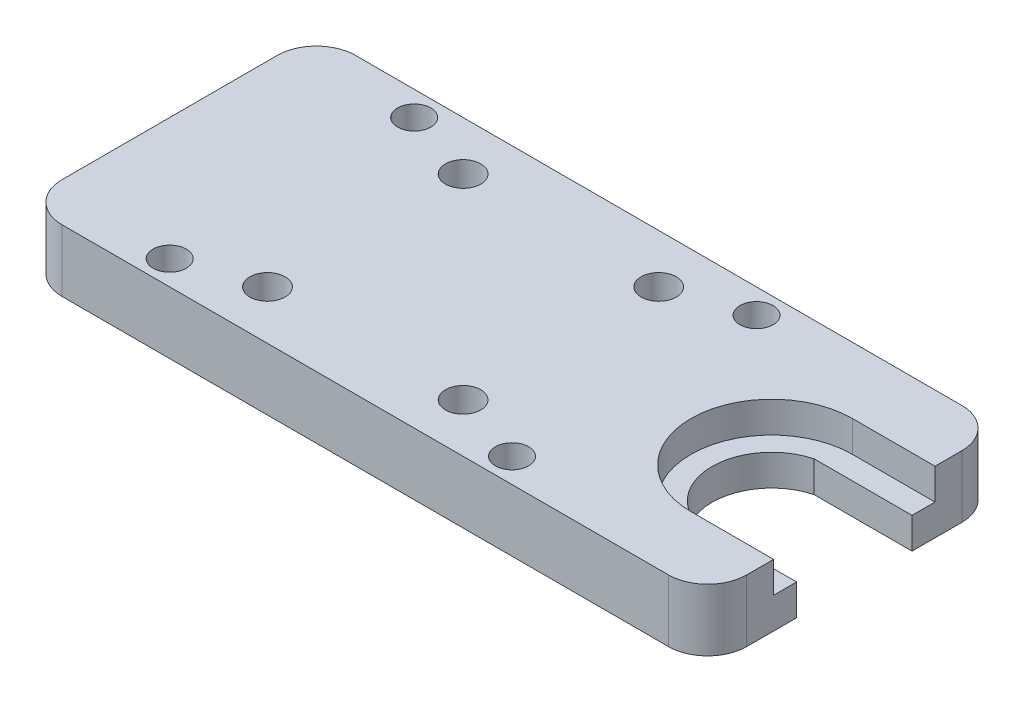
ISO-10303-21;
HEADER;
FILE_DESCRIPTION(('STEP AP214'),'2;1');
FILE_NAME('part.step','',(''),(''),'','','');
FILE_SCHEMA(('AUTOMOTIVE_DESIGN { 1 0 10303 214 1 1 1 1 }'));
ENDSEC;
DATA;
#1=APPLICATION_CONTEXT('core data for automotive mechanical design processes');
#2=APPLICATION_PROTOCOL_DEFINITION('international standard','automotive_design',2000,#1);
#3=PRODUCT_CONTEXT('',#1,'mechanical');
#4=PRODUCT('Part','Part','',(#3));
#5=PRODUCT_RELATED_PRODUCT_CATEGORY('part','',(#4));
#6=PRODUCT_DEFINITION_FORMATION('','',#4);
#7=PRODUCT_DEFINITION_CONTEXT('part definition',#1,'design');
#8=PRODUCT_DEFINITION('design','',#6,#7);
#9=PRODUCT_DEFINITION_SHAPE('','',#8);
#10=(LENGTH_UNIT() NAMED_UNIT(*) SI_UNIT(.MILLI.,.METRE.));
#11=(NAMED_UNIT(*) PLANE_ANGLE_UNIT() SI_UNIT($,.RADIAN.));
#12=(NAMED_UNIT(*) SI_UNIT($,.STERADIAN.) SOLID_ANGLE_UNIT());
#13=UNCERTAINTY_MEASURE_WITH_UNIT(LENGTH_MEASURE(1.E-05),#10,'distance_accuracy_value','');
#14=(GEOMETRIC_REPRESENTATION_CONTEXT(3) GLOBAL_UNCERTAINTY_ASSIGNED_CONTEXT((#13)) GLOBAL_UNIT_ASSIGNED_CONTEXT((#10,
#11,#12)) REPRESENTATION_CONTEXT('',''));
#15=CARTESIAN_POINT('',(0.,0.,0.));
#16=DIRECTION('',(0.,0.,1.));
#17=DIRECTION('',(1.,0.,0.));
#18=AXIS2_PLACEMENT_3D('',#15,#16,#17);
#19=CARTESIAN_POINT('',(28.5,6.35,3.));
#20=DIRECTION('',(1.,0.,0.));
#21=DIRECTION('',(0.,0.,-1.));
#22=AXIS2_PLACEMENT_3D('',#19,#20,#21);
#23=PLANE('',#22);
#24=DIRECTION('',(0.,0.,1.));
#25=VECTOR('',#24,1.);
#26=CARTESIAN_POINT('',(28.5,6.35,3.));
#27=LINE('',#26,#25);
#28=CARTESIAN_POINT('',(28.5,6.35,26.25));
#29=VERTEX_POINT('',#28);
#30=CARTESIAN_POINT('',(28.5,6.35,29.));
#31=VERTEX_POINT('',#30);
#32=EDGE_CURVE('E220',#29,#31,#27,.T.);
#33=ORIENTED_EDGE('',*,*,#32,.T.);
#34=DIRECTION('',(0.,-1.,0.));
#35=VECTOR('',#34,1.);
#36=CARTESIAN_POINT('',(28.5,6.35,29.));
#37=LINE('',#36,#35);
#38=CARTESIAN_POINT('',(28.5,0.,29.));
#39=VERTEX_POINT('',#38);
#40=EDGE_CURVE('E43',#31,#39,#37,.T.);
#41=ORIENTED_EDGE('',*,*,#40,.T.);
#42=DIRECTION('',(0.,0.,1.));
#43=VECTOR('',#42,1.);
#44=CARTESIAN_POINT('',(28.5,0.,3.));
#45=LINE('',#44,#43);
#46=CARTESIAN_POINT('',(28.5,0.,23.9));
#47=VERTEX_POINT('',#46);
#48=EDGE_CURVE('E229',#47,#39,#45,.T.);
#49=ORIENTED_EDGE('',*,*,#48,.F.);
#50=DIRECTION('',(0.,1.,0.));
#51=VECTOR('',#50,1.);
#52=CARTESIAN_POINT('',(28.5,0.,23.9));
#53=LINE('',#52,#51);
#54=CARTESIAN_POINT('',(28.5,3.175,23.9));
#55=VERTEX_POINT('',#54);
#56=EDGE_CURVE('E202',#47,#55,#53,.T.);
#57=ORIENTED_EDGE('',*,*,#56,.T.);
#58=DIRECTION('',(0.,0.,-1.));
#59=VECTOR('',#58,1.);
#60=CARTESIAN_POINT('',(28.5,3.175,9.75000000000001));
#61=LINE('',#60,#59);
#62=CARTESIAN_POINT('',(28.5,3.175,26.25));
#63=VERTEX_POINT('',#62);
#64=EDGE_CURVE('E160',#63,#55,#61,.T.);
#65=ORIENTED_EDGE('',*,*,#64,.F.);
#66=DIRECTION('',(0.,1.,0.));
#67=VECTOR('',#66,1.);
#68=CARTESIAN_POINT('',(28.5,3.175,26.25));
#69=LINE('',#68,#67);
#70=EDGE_CURVE('E189',#63,#29,#69,.T.);
#71=ORIENTED_EDGE('',*,*,#70,.T.);
#72=EDGE_LOOP('',(#33,#41,#49,#57,#65,#71));
#73=FACE_BOUND('',#72,.T.);
#74=ADVANCED_FACE('F35',(#73),#23,.T.);
#75=CARTESIAN_POINT('',(-41.5,6.35,33.));
#76=DIRECTION('',(-1.,0.,0.));
#77=DIRECTION('',(0.,0.,1.));
#78=AXIS2_PLACEMENT_3D('',#75,#76,#77);
#79=PLANE('',#78);
#80=DIRECTION('',(0.,0.,-1.));
#81=VECTOR('',#80,1.);
#82=CARTESIAN_POINT('',(-41.5,6.35,33.));
#83=LINE('',#82,#81);
#84=CARTESIAN_POINT('',(-41.5,6.35,29.));
#85=VERTEX_POINT('',#84);
#86=CARTESIAN_POINT('',(-41.5,6.35,7.));
#87=VERTEX_POINT('',#86);
#88=EDGE_CURVE('E213',#85,#87,#83,.T.);
#89=ORIENTED_EDGE('',*,*,#88,.T.);
#90=DIRECTION('',(0.,-1.,0.));
#91=VECTOR('',#90,1.);
#92=CARTESIAN_POINT('',(-41.5,6.35,7.));
#93=LINE('',#92,#91);
#94=CARTESIAN_POINT('',(-41.5,0.,7.));
#95=VERTEX_POINT('',#94);
#96=EDGE_CURVE('E237',#87,#95,#93,.T.);
#97=ORIENTED_EDGE('',*,*,#96,.T.);
#98=DIRECTION('',(0.,0.,-1.));
#99=VECTOR('',#98,1.);
#100=CARTESIAN_POINT('',(-41.5,0.,33.));
#101=LINE('',#100,#99);
#102=CARTESIAN_POINT('',(-41.5,0.,29.));
#103=VERTEX_POINT('',#102);
#104=EDGE_CURVE('E205',#103,#95,#101,.T.);
#105=ORIENTED_EDGE('',*,*,#104,.F.);
#106=DIRECTION('',(0.,-1.,0.));
#107=VECTOR('',#106,1.);
#108=CARTESIAN_POINT('',(-41.5,6.35,29.));
#109=LINE('',#108,#107);
#110=EDGE_CURVE('E235',#103,#85,#109,.F.);
#111=ORIENTED_EDGE('',*,*,#110,.T.);
#112=EDGE_LOOP('',(#89,#97,#105,#111));
#113=FACE_BOUND('',#112,.T.);
#114=ADVANCED_FACE('F312',(#113),#79,.T.);
#115=CARTESIAN_POINT('',(28.5,6.35,33.));
#116=DIRECTION('',(0.,0.,1.));
#117=DIRECTION('',(1.,0.,0.));
#118=AXIS2_PLACEMENT_3D('',#115,#116,#117);
#119=PLANE('',#118);
#120=DIRECTION('',(-1.,0.,0.));
#121=VECTOR('',#120,1.);
#122=CARTESIAN_POINT('',(28.5,6.35,33.));
#123=LINE('',#122,#121);
#124=CARTESIAN_POINT('',(24.5,6.35,33.));
#125=VERTEX_POINT('',#124);
#126=CARTESIAN_POINT('',(-37.5,6.35,33.));
#127=VERTEX_POINT('',#126);
#128=EDGE_CURVE('E222',#125,#127,#123,.T.);
#129=ORIENTED_EDGE('',*,*,#128,.T.);
#130=DIRECTION('',(0.,-1.,0.));
#131=VECTOR('',#130,1.);
#132=CARTESIAN_POINT('',(-37.5,6.35,33.));
#133=LINE('',#132,#131);
#134=CARTESIAN_POINT('',(-37.5,0.,33.));
#135=VERTEX_POINT('',#134);
#136=EDGE_CURVE('E261',#127,#135,#133,.T.);
#137=ORIENTED_EDGE('',*,*,#136,.T.);
#138=DIRECTION('',(-1.,0.,0.));
#139=VECTOR('',#138,1.);
#140=CARTESIAN_POINT('',(28.5,0.,33.));
#141=LINE('',#140,#139);
#142=CARTESIAN_POINT('',(24.5,0.,33.));
#143=VERTEX_POINT('',#142);
#144=EDGE_CURVE('E217',#143,#135,#141,.T.);
#145=ORIENTED_EDGE('',*,*,#144,.F.);
#146=DIRECTION('',(0.,-1.,0.));
#147=VECTOR('',#146,1.);
#148=CARTESIAN_POINT('',(24.5,6.35,33.));
#149=LINE('',#148,#147);
#150=EDGE_CURVE('E57',#143,#125,#149,.F.);
#151=ORIENTED_EDGE('',*,*,#150,.T.);
#152=EDGE_LOOP('',(#129,#137,#145,#151));
#153=FACE_BOUND('',#152,.T.);
#154=ADVANCED_FACE('F317',(#153),#119,.T.);
#155=CARTESIAN_POINT('',(28.5,0.,7.));
#156=VERTEX_POINT('',#155);
#157=CARTESIAN_POINT('',(28.5,0.,12.1));
#158=VERTEX_POINT('',#157);
#159=EDGE_CURVE('E230',#156,#158,#45,.T.);
#160=ORIENTED_EDGE('',*,*,#159,.F.);
#161=DIRECTION('',(0.,-1.,0.));
#162=VECTOR('',#161,1.);
#163=CARTESIAN_POINT('',(28.5,6.35,7.));
#164=LINE('',#163,#162);
#165=CARTESIAN_POINT('',(28.5,6.35,7.));
#166=VERTEX_POINT('',#165);
#167=EDGE_CURVE('E11',#156,#166,#164,.F.);
#168=ORIENTED_EDGE('',*,*,#167,.T.);
#169=CARTESIAN_POINT('',(28.5,6.35,9.75000000000001));
#170=VERTEX_POINT('',#169);
#171=EDGE_CURVE('E176',#166,#170,#27,.T.);
#172=ORIENTED_EDGE('',*,*,#171,.T.);
#173=DIRECTION('',(0.,1.,0.));
#174=VECTOR('',#173,1.);
#175=CARTESIAN_POINT('',(28.5,3.175,9.75000000000001));
#176=LINE('',#175,#174);
#177=CARTESIAN_POINT('',(28.5,3.175,9.75000000000001));
#178=VERTEX_POINT('',#177);
#179=EDGE_CURVE('E167',#178,#170,#176,.T.);
#180=ORIENTED_EDGE('',*,*,#179,.F.);
#181=CARTESIAN_POINT('',(28.5,3.175,12.1));
#182=VERTEX_POINT('',#181);
#183=EDGE_CURVE('E149',#182,#178,#61,.T.);
#184=ORIENTED_EDGE('',*,*,#183,.F.);
#185=DIRECTION('',(0.,1.,0.));
#186=VECTOR('',#185,1.);
#187=CARTESIAN_POINT('',(28.5,0.,12.1));
#188=LINE('',#187,#186);
#189=EDGE_CURVE('E201',#158,#182,#188,.T.);
#190=ORIENTED_EDGE('',*,*,#189,.F.);
#191=EDGE_LOOP('',(#160,#168,#172,#180,#184,#190));
#192=FACE_BOUND('',#191,.T.);
#193=ADVANCED_FACE('F174',(#192),#23,.T.);
#194=CARTESIAN_POINT('',(-41.5,6.35,3.));
#195=DIRECTION('',(0.,0.,-1.));
#196=DIRECTION('',(-1.,0.,0.));
#197=AXIS2_PLACEMENT_3D('',#194,#195,#196);
#198=PLANE('',#197);
#199=DIRECTION('',(1.,0.,0.));
#200=VECTOR('',#199,1.);
#201=CARTESIAN_POINT('',(-41.5,0.,3.));
#202=LINE('',#201,#200);
#203=CARTESIAN_POINT('',(-37.5,0.,3.));
#204=VERTEX_POINT('',#203);
#205=CARTESIAN_POINT('',(24.5,0.,3.));
#206=VERTEX_POINT('',#205);
#207=EDGE_CURVE('E226',#204,#206,#202,.T.);
#208=ORIENTED_EDGE('',*,*,#207,.F.);
#209=DIRECTION('',(0.,-1.,0.));
#210=VECTOR('',#209,1.);
#211=CARTESIAN_POINT('',(-37.5,6.35,3.));
#212=LINE('',#211,#210);
#213=CARTESIAN_POINT('',(-37.5,6.35,3.));
#214=VERTEX_POINT('',#213);
#215=EDGE_CURVE('E251',#204,#214,#212,.F.);
#216=ORIENTED_EDGE('',*,*,#215,.T.);
#217=DIRECTION('',(1.,0.,0.));
#218=VECTOR('',#217,1.);
#219=CARTESIAN_POINT('',(-41.5,6.35,3.));
#220=LINE('',#219,#218);
#221=CARTESIAN_POINT('',(24.5,6.35,3.));
#222=VERTEX_POINT('',#221);
#223=EDGE_CURVE('E216',#214,#222,#220,.T.);
#224=ORIENTED_EDGE('',*,*,#223,.T.);
#225=DIRECTION('',(0.,-1.,0.));
#226=VECTOR('',#225,1.);
#227=CARTESIAN_POINT('',(24.5,6.35,3.));
#228=LINE('',#227,#226);
#229=EDGE_CURVE('E248',#222,#206,#228,.T.);
#230=ORIENTED_EDGE('',*,*,#229,.T.);
#231=EDGE_LOOP('',(#208,#216,#224,#230));
#232=FACE_BOUND('',#231,.T.);
#233=ADVANCED_FACE('F323',(#232),#198,.T.);
#234=CARTESIAN_POINT('',(0.,6.35,0.));
#235=DIRECTION('',(0.,-1.,0.));
#236=DIRECTION('',(0.,0.,-1.));
#237=AXIS2_PLACEMENT_3D('',#234,#235,#236);
#238=PLANE('',#237);
#239=CARTESIAN_POINT('',(-29.,6.35,5.50000000000001));
#240=DIRECTION('',(0.,1.,0.));
#241=DIRECTION('',(0.,0.,1.));
#242=AXIS2_PLACEMENT_3D('',#239,#240,#241);
#243=CIRCLE('',#242,1.7);
#244=CARTESIAN_POINT('',(-29.,6.35,7.20000000000001));
#245=VERTEX_POINT('',#244);
#246=EDGE_CURVE('E394',#245,#245,#243,.T.);
#247=ORIENTED_EDGE('',*,*,#246,.F.);
#248=EDGE_LOOP('',(#247));
#249=FACE_BOUND('',#248,.T.);
#250=CARTESIAN_POINT('',(-29.,6.35,30.5));
#251=DIRECTION('',(0.,1.,0.));
#252=DIRECTION('',(0.,0.,1.));
#253=AXIS2_PLACEMENT_3D('',#250,#251,#252);
#254=CIRCLE('',#253,1.7);
#255=CARTESIAN_POINT('',(-29.,6.35,32.2));
#256=VERTEX_POINT('',#255);
#257=EDGE_CURVE('E396',#256,#256,#254,.T.);
#258=ORIENTED_EDGE('',*,*,#257,.F.);
#259=EDGE_LOOP('',(#258));
#260=FACE_BOUND('',#259,.T.);
#261=CARTESIAN_POINT('',(6.,6.35,30.5));
#262=DIRECTION('',(0.,1.,0.));
#263=DIRECTION('',(0.,0.,1.));
#264=AXIS2_PLACEMENT_3D('',#261,#262,#263);
#265=CIRCLE('',#264,1.7);
#266=CARTESIAN_POINT('',(6.,6.35,32.2));
#267=VERTEX_POINT('',#266);
#268=EDGE_CURVE('E404',#267,#267,#265,.T.);
#269=ORIENTED_EDGE('',*,*,#268,.F.);
#270=EDGE_LOOP('',(#269));
#271=FACE_BOUND('',#270,.T.);
#272=CARTESIAN_POINT('',(6.,6.35,5.50000000000001));
#273=DIRECTION('',(0.,1.,0.));
#274=DIRECTION('',(0.,0.,1.));
#275=AXIS2_PLACEMENT_3D('',#272,#273,#274);
#276=CIRCLE('',#275,1.7);
#277=CARTESIAN_POINT('',(6.,6.35,7.2));
#278=VERTEX_POINT('',#277);
#279=EDGE_CURVE('E410',#278,#278,#276,.T.);
#280=ORIENTED_EDGE('',*,*,#279,.F.);
#281=EDGE_LOOP('',(#280));
#282=FACE_BOUND('',#281,.T.);
#283=CARTESIAN_POINT('',(-21.5,6.35,28.));
#284=DIRECTION('',(0.,1.,0.));
#285=DIRECTION('',(0.,0.,1.));
#286=AXIS2_PLACEMENT_3D('',#283,#284,#285);
#287=CIRCLE('',#286,1.79999999999999);
#288=CARTESIAN_POINT('',(-21.5,6.35,29.8));
#289=VERTEX_POINT('',#288);
#290=EDGE_CURVE('E416',#289,#289,#287,.T.);
#291=ORIENTED_EDGE('',*,*,#290,.F.);
#292=EDGE_LOOP('',(#291));
#293=FACE_BOUND('',#292,.T.);
#294=CARTESIAN_POINT('',(-21.5,6.35,8.00000000000001));
#295=DIRECTION('',(0.,1.,0.));
#296=DIRECTION('',(0.,0.,1.));
#297=AXIS2_PLACEMENT_3D('',#294,#295,#296);
#298=CIRCLE('',#297,1.79999999999999);
#299=CARTESIAN_POINT('',(-21.5,6.35,9.79999999999999));
#300=VERTEX_POINT('',#299);
#301=EDGE_CURVE('E422',#300,#300,#298,.T.);
#302=ORIENTED_EDGE('',*,*,#301,.F.);
#303=EDGE_LOOP('',(#302));
#304=FACE_BOUND('',#303,.T.);
#305=CARTESIAN_POINT('',(-1.5,6.35,8.00000000000001));
#306=DIRECTION('',(0.,1.,0.));
#307=DIRECTION('',(0.,0.,1.));
#308=AXIS2_PLACEMENT_3D('',#305,#306,#307);
#309=CIRCLE('',#308,1.79999999999999);
#310=CARTESIAN_POINT('',(-1.5,6.35,9.79999999999999));
#311=VERTEX_POINT('',#310);
#312=EDGE_CURVE('E428',#311,#311,#309,.T.);
#313=ORIENTED_EDGE('',*,*,#312,.F.);
#314=EDGE_LOOP('',(#313));
#315=FACE_BOUND('',#314,.T.);
#316=CARTESIAN_POINT('',(-1.5,6.35,28.));
#317=DIRECTION('',(0.,1.,0.));
#318=DIRECTION('',(0.,0.,1.));
#319=AXIS2_PLACEMENT_3D('',#316,#317,#318);
#320=CIRCLE('',#319,1.79999999999999);
#321=CARTESIAN_POINT('',(-1.5,6.35,29.8));
#322=VERTEX_POINT('',#321);
#323=EDGE_CURVE('E433',#322,#322,#320,.T.);
#324=ORIENTED_EDGE('',*,*,#323,.F.);
#325=EDGE_LOOP('',(#324));
#326=FACE_BOUND('',#325,.T.);
#327=ORIENTED_EDGE('',*,*,#223,.F.);
#328=CARTESIAN_POINT('',(-37.5,6.35,7.));
#329=DIRECTION('',(0.,-1.,0.));
#330=DIRECTION('',(0.,0.,-1.));
#331=AXIS2_PLACEMENT_3D('',#328,#329,#330);
#332=CIRCLE('',#331,4.);
#333=EDGE_CURVE('E258',#214,#87,#332,.F.);
#334=ORIENTED_EDGE('',*,*,#333,.T.);
#335=ORIENTED_EDGE('',*,*,#88,.F.);
#336=CARTESIAN_POINT('',(-37.5,6.35,29.));
#337=DIRECTION('',(0.,-1.,0.));
#338=DIRECTION('',(0.,0.,-1.));
#339=AXIS2_PLACEMENT_3D('',#336,#337,#338);
#340=CIRCLE('',#339,4.);
#341=EDGE_CURVE('E50',#85,#127,#340,.F.);
#342=ORIENTED_EDGE('',*,*,#341,.T.);
#343=ORIENTED_EDGE('',*,*,#128,.F.);
#344=CARTESIAN_POINT('',(24.5,6.35,29.));
#345=DIRECTION('',(0.,-1.,0.));
#346=DIRECTION('',(0.,0.,-1.));
#347=AXIS2_PLACEMENT_3D('',#344,#345,#346);
#348=CIRCLE('',#347,4.);
#349=EDGE_CURVE('E255',#125,#31,#348,.F.);
#350=ORIENTED_EDGE('',*,*,#349,.T.);
#351=ORIENTED_EDGE('',*,*,#32,.F.);
#352=DIRECTION('',(1.,0.,0.));
#353=VECTOR('',#352,1.);
#354=CARTESIAN_POINT('',(28.5,6.35,26.25));
#355=LINE('',#354,#353);
#356=CARTESIAN_POINT('',(20.049193338483,6.35,26.25));
#357=VERTEX_POINT('',#356);
#358=EDGE_CURVE('E161',#357,#29,#355,.T.);
#359=ORIENTED_EDGE('',*,*,#358,.F.);
#360=CARTESIAN_POINT('',(20.049193338483,6.35,18.));
#361=DIRECTION('',(0.,1.,0.));
#362=DIRECTION('',(0.,0.,-1.));
#363=AXIS2_PLACEMENT_3D('',#360,#361,#362);
#364=CIRCLE('',#363,8.25);
#365=CARTESIAN_POINT('',(20.049193338483,6.35,9.75000000000001));
#366=VERTEX_POINT('',#365);
#367=EDGE_CURVE('E286',#366,#357,#364,.T.);
#368=ORIENTED_EDGE('',*,*,#367,.F.);
#369=DIRECTION('',(-1.,0.,0.));
#370=VECTOR('',#369,1.);
#371=CARTESIAN_POINT('',(28.5,6.35,9.75000000000001));
#372=LINE('',#371,#370);
#373=EDGE_CURVE('E284',#170,#366,#372,.T.);
#374=ORIENTED_EDGE('',*,*,#373,.F.);
#375=ORIENTED_EDGE('',*,*,#171,.F.);
#376=CARTESIAN_POINT('',(24.5,6.35,7.));
#377=DIRECTION('',(0.,-1.,0.));
#378=DIRECTION('',(0.,0.,-1.));
#379=AXIS2_PLACEMENT_3D('',#376,#377,#378);
#380=CIRCLE('',#379,4.);
#381=EDGE_CURVE('E253',#166,#222,#380,.F.);
#382=ORIENTED_EDGE('',*,*,#381,.T.);
#383=EDGE_LOOP('',(#327,#334,#335,#342,#343,#350,#351,#359,#368,#374,#375,#382));
#384=FACE_BOUND('',#383,.T.);
#385=ADVANCED_FACE('F298',(#249,#260,#271,#282,#293,#304,#315,#326,#384),#238,.F.);
#386=CARTESIAN_POINT('',(0.,0.,0.));
#387=DIRECTION('',(0.,-1.,0.));
#388=DIRECTION('',(0.,0.,-1.));
#389=AXIS2_PLACEMENT_3D('',#386,#387,#388);
#390=PLANE('',#389);
#391=CARTESIAN_POINT('',(-29.,0.,5.50000000000001));
#392=DIRECTION('',(0.,1.,0.));
#393=DIRECTION('',(0.,0.,1.));
#394=AXIS2_PLACEMENT_3D('',#391,#392,#393);
#395=CIRCLE('',#394,1.7);
#396=CARTESIAN_POINT('',(-29.,0.,7.2));
#397=VERTEX_POINT('',#396);
#398=EDGE_CURVE('E391',#397,#397,#395,.T.);
#399=ORIENTED_EDGE('',*,*,#398,.T.);
#400=EDGE_LOOP('',(#399));
#401=FACE_BOUND('',#400,.T.);
#402=CARTESIAN_POINT('',(-29.,0.,30.5));
#403=DIRECTION('',(0.,1.,0.));
#404=DIRECTION('',(0.,0.,1.));
#405=AXIS2_PLACEMENT_3D('',#402,#403,#404);
#406=CIRCLE('',#405,1.7);
#407=CARTESIAN_POINT('',(-29.,0.,32.2));
#408=VERTEX_POINT('',#407);
#409=EDGE_CURVE('E401',#408,#408,#406,.T.);
#410=ORIENTED_EDGE('',*,*,#409,.T.);
#411=EDGE_LOOP('',(#410));
#412=FACE_BOUND('',#411,.T.);
#413=CARTESIAN_POINT('',(6.,0.,30.5));
#414=DIRECTION('',(0.,1.,0.));
#415=DIRECTION('',(0.,0.,1.));
#416=AXIS2_PLACEMENT_3D('',#413,#414,#415);
#417=CIRCLE('',#416,1.7);
#418=CARTESIAN_POINT('',(6.,0.,32.2));
#419=VERTEX_POINT('',#418);
#420=EDGE_CURVE('E407',#419,#419,#417,.T.);
#421=ORIENTED_EDGE('',*,*,#420,.T.);
#422=EDGE_LOOP('',(#421));
#423=FACE_BOUND('',#422,.T.);
#424=CARTESIAN_POINT('',(6.,0.,5.50000000000001));
#425=DIRECTION('',(0.,1.,0.));
#426=DIRECTION('',(0.,0.,1.));
#427=AXIS2_PLACEMENT_3D('',#424,#425,#426);
#428=CIRCLE('',#427,1.7);
#429=CARTESIAN_POINT('',(6.,0.,7.2));
#430=VERTEX_POINT('',#429);
#431=EDGE_CURVE('E413',#430,#430,#428,.T.);
#432=ORIENTED_EDGE('',*,*,#431,.T.);
#433=EDGE_LOOP('',(#432));
#434=FACE_BOUND('',#433,.T.);
#435=CARTESIAN_POINT('',(-21.5,0.,28.));
#436=DIRECTION('',(0.,1.,0.));
#437=DIRECTION('',(0.,0.,1.));
#438=AXIS2_PLACEMENT_3D('',#435,#436,#437);
#439=CIRCLE('',#438,1.8);
#440=CARTESIAN_POINT('',(-21.5,0.,29.8));
#441=VERTEX_POINT('',#440);
#442=EDGE_CURVE('E419',#441,#441,#439,.T.);
#443=ORIENTED_EDGE('',*,*,#442,.T.);
#444=EDGE_LOOP('',(#443));
#445=FACE_BOUND('',#444,.T.);
#446=CARTESIAN_POINT('',(-21.5,0.,8.00000000000001));
#447=DIRECTION('',(0.,1.,0.));
#448=DIRECTION('',(0.,0.,1.));
#449=AXIS2_PLACEMENT_3D('',#446,#447,#448);
#450=CIRCLE('',#449,1.8);
#451=CARTESIAN_POINT('',(-21.5,0.,9.80000000000001));
#452=VERTEX_POINT('',#451);
#453=EDGE_CURVE('E425',#452,#452,#450,.T.);
#454=ORIENTED_EDGE('',*,*,#453,.T.);
#455=EDGE_LOOP('',(#454));
#456=FACE_BOUND('',#455,.T.);
#457=CARTESIAN_POINT('',(-1.5,0.,8.00000000000001));
#458=DIRECTION('',(0.,1.,0.));
#459=DIRECTION('',(0.,0.,1.));
#460=AXIS2_PLACEMENT_3D('',#457,#458,#459);
#461=CIRCLE('',#460,1.8);
#462=CARTESIAN_POINT('',(-1.5,0.,9.8));
#463=VERTEX_POINT('',#462);
#464=EDGE_CURVE('E431',#463,#463,#461,.T.);
#465=ORIENTED_EDGE('',*,*,#464,.T.);
#466=EDGE_LOOP('',(#465));
#467=FACE_BOUND('',#466,.T.);
#468=CARTESIAN_POINT('',(-1.5,0.,28.));
#469=DIRECTION('',(0.,1.,0.));
#470=DIRECTION('',(0.,0.,1.));
#471=AXIS2_PLACEMENT_3D('',#468,#469,#470);
#472=CIRCLE('',#471,1.8);
#473=CARTESIAN_POINT('',(-1.5,0.,29.8));
#474=VERTEX_POINT('',#473);
#475=EDGE_CURVE('E280',#474,#474,#472,.T.);
#476=ORIENTED_EDGE('',*,*,#475,.T.);
#477=EDGE_LOOP('',(#476));
#478=FACE_BOUND('',#477,.T.);
#479=ORIENTED_EDGE('',*,*,#104,.T.);
#480=CARTESIAN_POINT('',(-37.5,0.,7.));
#481=DIRECTION('',(0.,-1.,0.));
#482=DIRECTION('',(0.,0.,-1.));
#483=AXIS2_PLACEMENT_3D('',#480,#481,#482);
#484=CIRCLE('',#483,4.);
#485=EDGE_CURVE('E246',#95,#204,#484,.T.);
#486=ORIENTED_EDGE('',*,*,#485,.T.);
#487=ORIENTED_EDGE('',*,*,#207,.T.);
#488=CARTESIAN_POINT('',(24.5,0.,7.));
#489=DIRECTION('',(0.,-1.,0.));
#490=DIRECTION('',(0.,0.,-1.));
#491=AXIS2_PLACEMENT_3D('',#488,#489,#490);
#492=CIRCLE('',#491,4.);
#493=EDGE_CURVE('E240',#206,#156,#492,.T.);
#494=ORIENTED_EDGE('',*,*,#493,.T.);
#495=ORIENTED_EDGE('',*,*,#159,.T.);
#496=DIRECTION('',(-1.,0.,0.));
#497=VECTOR('',#496,1.);
#498=CARTESIAN_POINT('',(28.5,0.,12.1));
#499=LINE('',#498,#497);
#500=CARTESIAN_POINT('',(18.5,0.,12.1));
#501=VERTEX_POINT('',#500);
#502=EDGE_CURVE('E192',#158,#501,#499,.T.);
#503=ORIENTED_EDGE('',*,*,#502,.T.);
#504=CARTESIAN_POINT('',(20.049193338483,0.,18.));
#505=DIRECTION('',(0.,1.,0.));
#506=DIRECTION('',(0.,0.,1.));
#507=AXIS2_PLACEMENT_3D('',#504,#505,#506);
#508=CIRCLE('',#507,6.1);
#509=CARTESIAN_POINT('',(18.5,0.,23.9));
#510=VERTEX_POINT('',#509);
#511=EDGE_CURVE('E195',#501,#510,#508,.T.);
#512=ORIENTED_EDGE('',*,*,#511,.T.);
#513=DIRECTION('',(1.,0.,0.));
#514=VECTOR('',#513,1.);
#515=CARTESIAN_POINT('',(28.5,0.,23.9));
#516=LINE('',#515,#514);
#517=EDGE_CURVE('E198',#510,#47,#516,.T.);
#518=ORIENTED_EDGE('',*,*,#517,.T.);
#519=ORIENTED_EDGE('',*,*,#48,.T.);
#520=CARTESIAN_POINT('',(24.5,0.,29.));
#521=DIRECTION('',(0.,-1.,0.));
#522=DIRECTION('',(0.,0.,-1.));
#523=AXIS2_PLACEMENT_3D('',#520,#521,#522);
#524=CIRCLE('',#523,4.);
#525=EDGE_CURVE('E242',#39,#143,#524,.T.);
#526=ORIENTED_EDGE('',*,*,#525,.T.);
#527=ORIENTED_EDGE('',*,*,#144,.T.);
#528=CARTESIAN_POINT('',(-37.5,0.,29.));
#529=DIRECTION('',(0.,-1.,0.));
#530=DIRECTION('',(0.,0.,-1.));
#531=AXIS2_PLACEMENT_3D('',#528,#529,#530);
#532=CIRCLE('',#531,4.);
#533=EDGE_CURVE('E244',#135,#103,#532,.T.);
#534=ORIENTED_EDGE('',*,*,#533,.T.);
#535=EDGE_LOOP('',(#479,#486,#487,#494,#495,#503,#512,#518,#519,#526,#527,#534));
#536=FACE_BOUND('',#535,.T.);
#537=ADVANCED_FACE('F274',(#401,#412,#423,#434,#445,#456,#467,#478,#536),#390,.T.);
#538=CARTESIAN_POINT('',(28.5,0.,23.9));
#539=DIRECTION('',(0.,0.,1.));
#540=DIRECTION('',(1.,0.,0.));
#541=AXIS2_PLACEMENT_3D('',#538,#539,#540);
#542=PLANE('',#541);
#543=DIRECTION('',(0.,1.,0.));
#544=VECTOR('',#543,1.);
#545=CARTESIAN_POINT('',(18.5,0.,23.9));
#546=LINE('',#545,#544);
#547=CARTESIAN_POINT('',(18.5,3.175,23.9));
#548=VERTEX_POINT('',#547);
#549=EDGE_CURVE('E206',#510,#548,#546,.T.);
#550=ORIENTED_EDGE('',*,*,#549,.T.);
#551=DIRECTION('',(1.,0.,0.));
#552=VECTOR('',#551,1.);
#553=CARTESIAN_POINT('',(28.5,3.175,23.9));
#554=LINE('',#553,#552);
#555=EDGE_CURVE('E188',#548,#55,#554,.T.);
#556=ORIENTED_EDGE('',*,*,#555,.T.);
#557=ORIENTED_EDGE('',*,*,#56,.F.);
#558=ORIENTED_EDGE('',*,*,#517,.F.);
#559=EDGE_LOOP('',(#550,#556,#557,#558));
#560=FACE_BOUND('',#559,.T.);
#561=ADVANCED_FACE('F277',(#560),#542,.F.);
#562=CARTESIAN_POINT('',(20.049193338483,0.,18.));
#563=DIRECTION('',(0.,1.,0.));
#564=DIRECTION('',(0.,0.,1.));
#565=AXIS2_PLACEMENT_3D('',#562,#563,#564);
#566=CYLINDRICAL_SURFACE('',#565,6.1);
#567=DIRECTION('',(0.,1.,0.));
#568=VECTOR('',#567,1.);
#569=CARTESIAN_POINT('',(18.5,0.,12.1));
#570=LINE('',#569,#568);
#571=CARTESIAN_POINT('',(18.5,3.175,12.1));
#572=VERTEX_POINT('',#571);
#573=EDGE_CURVE('E209',#501,#572,#570,.T.);
#574=ORIENTED_EDGE('',*,*,#573,.T.);
#575=CARTESIAN_POINT('',(20.049193338483,3.175,18.));
#576=DIRECTION('',(0.,-1.,0.));
#577=DIRECTION('',(0.,0.,-1.));
#578=AXIS2_PLACEMENT_3D('',#575,#576,#577);
#579=CIRCLE('',#578,6.1);
#580=EDGE_CURVE('E185',#572,#548,#579,.F.);
#581=ORIENTED_EDGE('',*,*,#580,.T.);
#582=ORIENTED_EDGE('',*,*,#549,.F.);
#583=ORIENTED_EDGE('',*,*,#511,.F.);
#584=EDGE_LOOP('',(#574,#581,#582,#583));
#585=FACE_BOUND('',#584,.T.);
#586=ADVANCED_FACE('F341',(#585),#566,.F.);
#587=CARTESIAN_POINT('',(28.5,0.,12.1));
#588=DIRECTION('',(0.,0.,-1.));
#589=DIRECTION('',(-1.,0.,0.));
#590=AXIS2_PLACEMENT_3D('',#587,#588,#589);
#591=PLANE('',#590);
#592=ORIENTED_EDGE('',*,*,#189,.T.);
#593=DIRECTION('',(-1.,0.,0.));
#594=VECTOR('',#593,1.);
#595=CARTESIAN_POINT('',(28.5,3.175,12.1));
#596=LINE('',#595,#594);
#597=EDGE_CURVE('E155',#182,#572,#596,.T.);
#598=ORIENTED_EDGE('',*,*,#597,.T.);
#599=ORIENTED_EDGE('',*,*,#573,.F.);
#600=ORIENTED_EDGE('',*,*,#502,.F.);
#601=EDGE_LOOP('',(#592,#598,#599,#600));
#602=FACE_BOUND('',#601,.T.);
#603=ADVANCED_FACE('F338',(#602),#591,.F.);
#604=CARTESIAN_POINT('',(20.049193338483,3.175,18.));
#605=DIRECTION('',(0.,-1.,0.));
#606=DIRECTION('',(0.,0.,-1.));
#607=AXIS2_PLACEMENT_3D('',#604,#605,#606);
#608=PLANE('',#607);
#609=ORIENTED_EDGE('',*,*,#580,.F.);
#610=ORIENTED_EDGE('',*,*,#597,.F.);
#611=ORIENTED_EDGE('',*,*,#183,.T.);
#612=DIRECTION('',(-1.,0.,0.));
#613=VECTOR('',#612,1.);
#614=CARTESIAN_POINT('',(28.5,3.175,9.75000000000001));
#615=LINE('',#614,#613);
#616=CARTESIAN_POINT('',(20.049193338483,3.175,9.75000000000001));
#617=VERTEX_POINT('',#616);
#618=EDGE_CURVE('E153',#178,#617,#615,.T.);
#619=ORIENTED_EDGE('',*,*,#618,.T.);
#620=CARTESIAN_POINT('',(20.049193338483,3.175,18.));
#621=DIRECTION('',(0.,1.,0.));
#622=DIRECTION('',(0.,0.,-1.));
#623=AXIS2_PLACEMENT_3D('',#620,#621,#622);
#624=CIRCLE('',#623,8.25);
#625=CARTESIAN_POINT('',(20.049193338483,3.175,26.25));
#626=VERTEX_POINT('',#625);
#627=EDGE_CURVE('E171',#617,#626,#624,.T.);
#628=ORIENTED_EDGE('',*,*,#627,.T.);
#629=DIRECTION('',(1.,0.,0.));
#630=VECTOR('',#629,1.);
#631=CARTESIAN_POINT('',(28.5,3.175,26.25));
#632=LINE('',#631,#630);
#633=EDGE_CURVE('E177',#626,#63,#632,.T.);
#634=ORIENTED_EDGE('',*,*,#633,.T.);
#635=ORIENTED_EDGE('',*,*,#64,.T.);
#636=ORIENTED_EDGE('',*,*,#555,.F.);
#637=EDGE_LOOP('',(#609,#610,#611,#619,#628,#634,#635,#636));
#638=FACE_BOUND('',#637,.T.);
#639=ADVANCED_FACE('F151',(#638),#608,.F.);
#640=CARTESIAN_POINT('',(28.5,3.175,26.25));
#641=DIRECTION('',(0.,0.,1.));
#642=DIRECTION('',(1.,0.,0.));
#643=AXIS2_PLACEMENT_3D('',#640,#641,#642);
#644=PLANE('',#643);
#645=ORIENTED_EDGE('',*,*,#358,.T.);
#646=ORIENTED_EDGE('',*,*,#70,.F.);
#647=ORIENTED_EDGE('',*,*,#633,.F.);
#648=DIRECTION('',(0.,1.,0.));
#649=VECTOR('',#648,1.);
#650=CARTESIAN_POINT('',(20.049193338483,3.175,26.25));
#651=LINE('',#650,#649);
#652=EDGE_CURVE('E179',#626,#357,#651,.T.);
#653=ORIENTED_EDGE('',*,*,#652,.T.);
#654=EDGE_LOOP('',(#645,#646,#647,#653));
#655=FACE_BOUND('',#654,.T.);
#656=ADVANCED_FACE('F292',(#655),#644,.F.);
#657=CARTESIAN_POINT('',(20.049193338483,3.175,18.));
#658=DIRECTION('',(0.,1.,0.));
#659=DIRECTION('',(0.,0.,1.));
#660=AXIS2_PLACEMENT_3D('',#657,#658,#659);
#661=CYLINDRICAL_SURFACE('',#660,8.25);
#662=ORIENTED_EDGE('',*,*,#367,.T.);
#663=ORIENTED_EDGE('',*,*,#652,.F.);
#664=ORIENTED_EDGE('',*,*,#627,.F.);
#665=DIRECTION('',(0.,1.,0.));
#666=VECTOR('',#665,1.);
#667=CARTESIAN_POINT('',(20.049193338483,3.175,9.75000000000001));
#668=LINE('',#667,#666);
#669=EDGE_CURVE('E169',#617,#366,#668,.T.);
#670=ORIENTED_EDGE('',*,*,#669,.T.);
#671=EDGE_LOOP('',(#662,#663,#664,#670));
#672=FACE_BOUND('',#671,.T.);
#673=ADVANCED_FACE('F296',(#672),#661,.F.);
#674=CARTESIAN_POINT('',(28.5,3.175,9.75000000000001));
#675=DIRECTION('',(0.,0.,-1.));
#676=DIRECTION('',(-1.,0.,0.));
#677=AXIS2_PLACEMENT_3D('',#674,#675,#676);
#678=PLANE('',#677);
#679=ORIENTED_EDGE('',*,*,#373,.T.);
#680=ORIENTED_EDGE('',*,*,#669,.F.);
#681=ORIENTED_EDGE('',*,*,#618,.F.);
#682=ORIENTED_EDGE('',*,*,#179,.T.);
#683=EDGE_LOOP('',(#679,#680,#681,#682));
#684=FACE_BOUND('',#683,.T.);
#685=ADVANCED_FACE('F166',(#684),#678,.F.);
#686=CARTESIAN_POINT('',(-1.5,6.35,28.));
#687=DIRECTION('',(0.,1.,0.));
#688=DIRECTION('',(0.,0.,1.));
#689=AXIS2_PLACEMENT_3D('',#686,#687,#688);
#690=CYLINDRICAL_SURFACE('',#689,1.79999999999999);
#691=ORIENTED_EDGE('',*,*,#475,.F.);
#692=EDGE_LOOP('',(#691));
#693=FACE_BOUND('',#692,.T.);
#694=ORIENTED_EDGE('',*,*,#323,.T.);
#695=EDGE_LOOP('',(#694));
#696=FACE_BOUND('',#695,.T.);
#697=ADVANCED_FACE('F350',(#693,#696),#690,.F.);
#698=CARTESIAN_POINT('',(-1.5,6.35,8.00000000000001));
#699=DIRECTION('',(0.,1.,0.));
#700=DIRECTION('',(0.,0.,1.));
#701=AXIS2_PLACEMENT_3D('',#698,#699,#700);
#702=CYLINDRICAL_SURFACE('',#701,1.79999999999999);
#703=ORIENTED_EDGE('',*,*,#464,.F.);
#704=EDGE_LOOP('',(#703));
#705=FACE_BOUND('',#704,.T.);
#706=ORIENTED_EDGE('',*,*,#312,.T.);
#707=EDGE_LOOP('',(#706));
#708=FACE_BOUND('',#707,.T.);
#709=ADVANCED_FACE('F359',(#705,#708),#702,.F.);
#710=CARTESIAN_POINT('',(-21.5,6.35,8.00000000000001));
#711=DIRECTION('',(0.,1.,0.));
#712=DIRECTION('',(0.,0.,1.));
#713=AXIS2_PLACEMENT_3D('',#710,#711,#712);
#714=CYLINDRICAL_SURFACE('',#713,1.79999999999999);
#715=ORIENTED_EDGE('',*,*,#453,.F.);
#716=EDGE_LOOP('',(#715));
#717=FACE_BOUND('',#716,.T.);
#718=ORIENTED_EDGE('',*,*,#301,.T.);
#719=EDGE_LOOP('',(#718));
#720=FACE_BOUND('',#719,.T.);
#721=ADVANCED_FACE('F363',(#717,#720),#714,.F.);
#722=CARTESIAN_POINT('',(-21.5,6.35,28.));
#723=DIRECTION('',(0.,1.,0.));
#724=DIRECTION('',(0.,0.,1.));
#725=AXIS2_PLACEMENT_3D('',#722,#723,#724);
#726=CYLINDRICAL_SURFACE('',#725,1.79999999999999);
#727=ORIENTED_EDGE('',*,*,#442,.F.);
#728=EDGE_LOOP('',(#727));
#729=FACE_BOUND('',#728,.T.);
#730=ORIENTED_EDGE('',*,*,#290,.T.);
#731=EDGE_LOOP('',(#730));
#732=FACE_BOUND('',#731,.T.);
#733=ADVANCED_FACE('F367',(#729,#732),#726,.F.);
#734=CARTESIAN_POINT('',(-37.5,6.35,7.));
#735=DIRECTION('',(0.,-1.,0.));
#736=DIRECTION('',(0.,0.,-1.));
#737=AXIS2_PLACEMENT_3D('',#734,#735,#736);
#738=CYLINDRICAL_SURFACE('',#737,4.);
#739=ORIENTED_EDGE('',*,*,#333,.F.);
#740=ORIENTED_EDGE('',*,*,#215,.F.);
#741=ORIENTED_EDGE('',*,*,#485,.F.);
#742=ORIENTED_EDGE('',*,*,#96,.F.);
#743=EDGE_LOOP('',(#739,#740,#741,#742));
#744=FACE_BOUND('',#743,.T.);
#745=ADVANCED_FACE('F308',(#744),#738,.T.);
#746=CARTESIAN_POINT('',(-37.5,6.35,29.));
#747=DIRECTION('',(0.,-1.,0.));
#748=DIRECTION('',(0.,0.,-1.));
#749=AXIS2_PLACEMENT_3D('',#746,#747,#748);
#750=CYLINDRICAL_SURFACE('',#749,4.);
#751=ORIENTED_EDGE('',*,*,#341,.F.);
#752=ORIENTED_EDGE('',*,*,#110,.F.);
#753=ORIENTED_EDGE('',*,*,#533,.F.);
#754=ORIENTED_EDGE('',*,*,#136,.F.);
#755=EDGE_LOOP('',(#751,#752,#753,#754));
#756=FACE_BOUND('',#755,.T.);
#757=ADVANCED_FACE('F301',(#756),#750,.T.);
#758=CARTESIAN_POINT('',(24.5,6.35,29.));
#759=DIRECTION('',(0.,-1.,0.));
#760=DIRECTION('',(0.,0.,-1.));
#761=AXIS2_PLACEMENT_3D('',#758,#759,#760);
#762=CYLINDRICAL_SURFACE('',#761,4.);
#763=ORIENTED_EDGE('',*,*,#349,.F.);
#764=ORIENTED_EDGE('',*,*,#150,.F.);
#765=ORIENTED_EDGE('',*,*,#525,.F.);
#766=ORIENTED_EDGE('',*,*,#40,.F.);
#767=EDGE_LOOP('',(#763,#764,#765,#766));
#768=FACE_BOUND('',#767,.T.);
#769=ADVANCED_FACE('F299',(#768),#762,.T.);
#770=CARTESIAN_POINT('',(24.5,6.35,7.));
#771=DIRECTION('',(0.,-1.,0.));
#772=DIRECTION('',(0.,0.,-1.));
#773=AXIS2_PLACEMENT_3D('',#770,#771,#772);
#774=CYLINDRICAL_SURFACE('',#773,4.);
#775=ORIENTED_EDGE('',*,*,#381,.F.);
#776=ORIENTED_EDGE('',*,*,#167,.F.);
#777=ORIENTED_EDGE('',*,*,#493,.F.);
#778=ORIENTED_EDGE('',*,*,#229,.F.);
#779=EDGE_LOOP('',(#775,#776,#777,#778));
#780=FACE_BOUND('',#779,.T.);
#781=ADVANCED_FACE('F37',(#780),#774,.T.);
#782=CARTESIAN_POINT('',(6.,6.35,5.50000000000001));
#783=DIRECTION('',(0.,1.,0.));
#784=DIRECTION('',(0.,0.,1.));
#785=AXIS2_PLACEMENT_3D('',#782,#783,#784);
#786=CYLINDRICAL_SURFACE('',#785,1.7);
#787=ORIENTED_EDGE('',*,*,#431,.F.);
#788=EDGE_LOOP('',(#787));
#789=FACE_BOUND('',#788,.T.);
#790=ORIENTED_EDGE('',*,*,#279,.T.);
#791=EDGE_LOOP('',(#790));
#792=FACE_BOUND('',#791,.T.);
#793=ADVANCED_FACE('F306',(#789,#792),#786,.F.);
#794=CARTESIAN_POINT('',(6.,6.35,30.5));
#795=DIRECTION('',(0.,1.,0.));
#796=DIRECTION('',(0.,0.,1.));
#797=AXIS2_PLACEMENT_3D('',#794,#795,#796);
#798=CYLINDRICAL_SURFACE('',#797,1.7);
#799=ORIENTED_EDGE('',*,*,#420,.F.);
#800=EDGE_LOOP('',(#799));
#801=FACE_BOUND('',#800,.T.);
#802=ORIENTED_EDGE('',*,*,#268,.T.);
#803=EDGE_LOOP('',(#802));
#804=FACE_BOUND('',#803,.T.);
#805=ADVANCED_FACE('F374',(#801,#804),#798,.F.);
#806=CARTESIAN_POINT('',(-29.,6.35,30.5));
#807=DIRECTION('',(0.,1.,0.));
#808=DIRECTION('',(0.,0.,1.));
#809=AXIS2_PLACEMENT_3D('',#806,#807,#808);
#810=CYLINDRICAL_SURFACE('',#809,1.7);
#811=ORIENTED_EDGE('',*,*,#409,.F.);
#812=EDGE_LOOP('',(#811));
#813=FACE_BOUND('',#812,.T.);
#814=ORIENTED_EDGE('',*,*,#257,.T.);
#815=EDGE_LOOP('',(#814));
#816=FACE_BOUND('',#815,.T.);
#817=ADVANCED_FACE('F378',(#813,#816),#810,.F.);
#818=CARTESIAN_POINT('',(-29.,6.35,5.50000000000001));
#819=DIRECTION('',(0.,1.,0.));
#820=DIRECTION('',(0.,0.,1.));
#821=AXIS2_PLACEMENT_3D('',#818,#819,#820);
#822=CYLINDRICAL_SURFACE('',#821,1.7);
#823=ORIENTED_EDGE('',*,*,#398,.F.);
#824=EDGE_LOOP('',(#823));
#825=FACE_BOUND('',#824,.T.);
#826=ORIENTED_EDGE('',*,*,#246,.T.);
#827=EDGE_LOOP('',(#826));
#828=FACE_BOUND('',#827,.T.);
#829=ADVANCED_FACE('F382',(#825,#828),#822,.F.);
#830=CLOSED_SHELL('',(#74,#114,#154,#193,#233,#385,#537,#561,#586,#603,#639,#656,#673,#685,#697,
#709,#721,#733,#745,#757,#769,#781,#793,#805,#817,#829));
#831=MANIFOLD_SOLID_BREP('B2',#830);
#832=ADVANCED_BREP_SHAPE_REPRESENTATION('',(#18,#831),#14);
#833=SHAPE_DEFINITION_REPRESENTATION(#9,#832);
ENDSEC;
END-ISO-10303-21;
